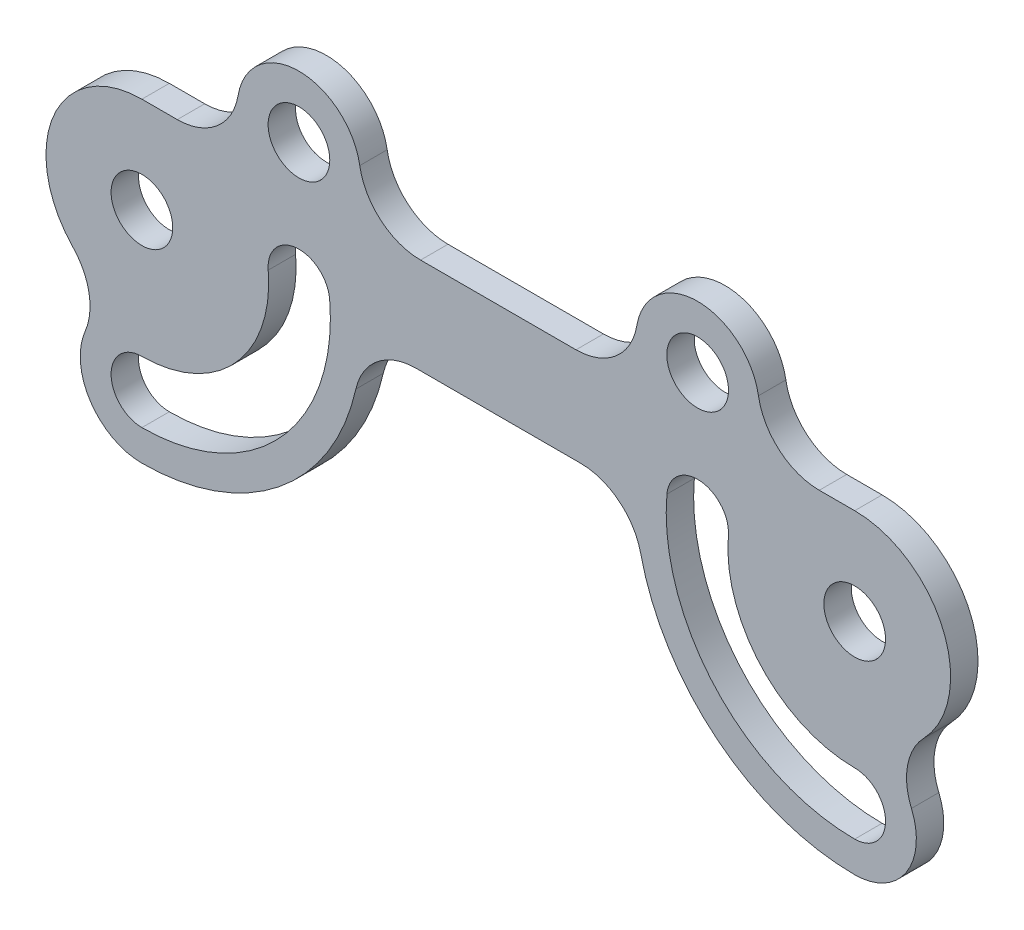
ISO-10303-21;
HEADER;
FILE_DESCRIPTION(('STEP AP214'),'2;1');
FILE_NAME('part.step','',(''),(''),'','','');
FILE_SCHEMA(('AUTOMOTIVE_DESIGN { 1 0 10303 214 1 1 1 1 }'));
ENDSEC;
DATA;
#1=APPLICATION_CONTEXT('core data for automotive mechanical design processes');
#2=APPLICATION_PROTOCOL_DEFINITION('international standard','automotive_design',2000,#1);
#3=PRODUCT_CONTEXT('',#1,'mechanical');
#4=PRODUCT('Part','Part','',(#3));
#5=PRODUCT_RELATED_PRODUCT_CATEGORY('part','',(#4));
#6=PRODUCT_DEFINITION_FORMATION('','',#4);
#7=PRODUCT_DEFINITION_CONTEXT('part definition',#1,'design');
#8=PRODUCT_DEFINITION('design','',#6,#7);
#9=PRODUCT_DEFINITION_SHAPE('','',#8);
#10=(LENGTH_UNIT() NAMED_UNIT(*) SI_UNIT(.MILLI.,.METRE.));
#11=(NAMED_UNIT(*) PLANE_ANGLE_UNIT() SI_UNIT($,.RADIAN.));
#12=(NAMED_UNIT(*) SI_UNIT($,.STERADIAN.) SOLID_ANGLE_UNIT());
#13=UNCERTAINTY_MEASURE_WITH_UNIT(LENGTH_MEASURE(1.E-05),#10,'distance_accuracy_value','');
#14=(GEOMETRIC_REPRESENTATION_CONTEXT(3) GLOBAL_UNCERTAINTY_ASSIGNED_CONTEXT((#13)) GLOBAL_UNIT_ASSIGNED_CONTEXT((#10,
#11,#12)) REPRESENTATION_CONTEXT('',''));
#15=CARTESIAN_POINT('',(0.,0.,0.));
#16=DIRECTION('',(0.,0.,1.));
#17=DIRECTION('',(1.,0.,0.));
#18=AXIS2_PLACEMENT_3D('',#15,#16,#17);
#19=CARTESIAN_POINT('',(0.,-9.128125,1.5875));
#20=DIRECTION('',(0.,0.,-1.));
#21=DIRECTION('',(-1.,0.,0.));
#22=AXIS2_PLACEMENT_3D('',#19,#20,#21);
#23=CYLINDRICAL_SURFACE('',#22,1.7859375);
#24=CARTESIAN_POINT('',(0.,-9.128125,0.));
#25=DIRECTION('',(0.,0.,1.));
#26=DIRECTION('',(1.,0.,0.));
#27=AXIS2_PLACEMENT_3D('',#24,#25,#26);
#28=CIRCLE('',#27,1.7859375);
#29=CARTESIAN_POINT('',(0.,-7.3421875,0.));
#30=VERTEX_POINT('',#29);
#31=CARTESIAN_POINT('',(0.,-10.9140625,0.));
#32=VERTEX_POINT('',#31);
#33=EDGE_CURVE('E388',#30,#32,#28,.T.);
#34=ORIENTED_EDGE('',*,*,#33,.F.);
#35=DIRECTION('',(0.,0.,-1.));
#36=VECTOR('',#35,1.);
#37=CARTESIAN_POINT('',(0.,-7.3421875,1.5875));
#38=LINE('',#37,#36);
#39=CARTESIAN_POINT('',(0.,-7.3421875,1.5875));
#40=VERTEX_POINT('',#39);
#41=EDGE_CURVE('E425',#40,#30,#38,.T.);
#42=ORIENTED_EDGE('',*,*,#41,.F.);
#43=CARTESIAN_POINT('',(0.,-9.128125,1.5875));
#44=DIRECTION('',(0.,0.,1.));
#45=DIRECTION('',(1.,0.,0.));
#46=AXIS2_PLACEMENT_3D('',#43,#44,#45);
#47=CIRCLE('',#46,1.7859375);
#48=CARTESIAN_POINT('',(0.,-10.9140625,1.5875));
#49=VERTEX_POINT('',#48);
#50=EDGE_CURVE('E303',#40,#49,#47,.T.);
#51=ORIENTED_EDGE('',*,*,#50,.T.);
#52=DIRECTION('',(0.,0.,-1.));
#53=VECTOR('',#52,1.);
#54=CARTESIAN_POINT('',(0.,-10.9140625,1.5875));
#55=LINE('',#54,#53);
#56=EDGE_CURVE('E415',#49,#32,#55,.T.);
#57=ORIENTED_EDGE('',*,*,#56,.T.);
#58=EDGE_LOOP('',(#34,#42,#51,#57));
#59=FACE_BOUND('',#58,.T.);
#60=ADVANCED_FACE('F39',(#59),#23,.F.);
#61=CARTESIAN_POINT('',(0.,0.,1.5875));
#62=DIRECTION('',(0.,0.,-1.));
#63=DIRECTION('',(-1.,0.,0.));
#64=AXIS2_PLACEMENT_3D('',#61,#62,#63);
#65=CYLINDRICAL_SURFACE('',#64,7.3421875);
#66=CARTESIAN_POINT('',(0.,0.,0.));
#67=DIRECTION('',(0.,0.,1.));
#68=DIRECTION('',(1.,0.,0.));
#69=AXIS2_PLACEMENT_3D('',#66,#67,#68);
#70=CIRCLE('',#69,7.3421875);
#71=CARTESIAN_POINT('',(7.31424825989549,0.639913804955099,0.));
#72=VERTEX_POINT('',#71);
#73=EDGE_CURVE('E392',#30,#72,#70,.T.);
#74=ORIENTED_EDGE('',*,*,#73,.T.);
#75=DIRECTION('',(0.,0.,-1.));
#76=VECTOR('',#75,1.);
#77=CARTESIAN_POINT('',(7.31424825989549,0.639913804955099,1.5875));
#78=LINE('',#77,#76);
#79=CARTESIAN_POINT('',(7.31424825989549,0.639913804955099,1.5875));
#80=VERTEX_POINT('',#79);
#81=EDGE_CURVE('E422',#80,#72,#78,.T.);
#82=ORIENTED_EDGE('',*,*,#81,.F.);
#83=CARTESIAN_POINT('',(0.,0.,1.5875));
#84=DIRECTION('',(0.,0.,1.));
#85=DIRECTION('',(1.,0.,0.));
#86=AXIS2_PLACEMENT_3D('',#83,#84,#85);
#87=CIRCLE('',#86,7.3421875);
#88=EDGE_CURVE('E307',#40,#80,#87,.T.);
#89=ORIENTED_EDGE('',*,*,#88,.F.);
#90=ORIENTED_EDGE('',*,*,#41,.T.);
#91=EDGE_LOOP('',(#74,#82,#89,#90));
#92=FACE_BOUND('',#91,.T.);
#93=ADVANCED_FACE('F605',(#92),#65,.T.);
#94=CARTESIAN_POINT('',(9.09338972851871,0.795568514268501,1.5875));
#95=DIRECTION('',(0.,0.,-1.));
#96=DIRECTION('',(-1.,0.,0.));
#97=AXIS2_PLACEMENT_3D('',#94,#95,#96);
#98=CYLINDRICAL_SURFACE('',#97,1.7859375);
#99=CARTESIAN_POINT('',(9.09338972851871,0.795568514268501,0.));
#100=DIRECTION('',(0.,0.,1.));
#101=DIRECTION('',(1.,0.,0.));
#102=AXIS2_PLACEMENT_3D('',#99,#100,#101);
#103=CIRCLE('',#102,1.7859375);
#104=CARTESIAN_POINT('',(10.8725311971419,0.951223223581904,0.));
#105=VERTEX_POINT('',#104);
#106=EDGE_CURVE('E396',#105,#72,#103,.T.);
#107=ORIENTED_EDGE('',*,*,#106,.F.);
#108=DIRECTION('',(0.,0.,-1.));
#109=VECTOR('',#108,1.);
#110=CARTESIAN_POINT('',(10.8725311971419,0.951223223581904,1.5875));
#111=LINE('',#110,#109);
#112=CARTESIAN_POINT('',(10.8725311971419,0.951223223581904,1.5875));
#113=VERTEX_POINT('',#112);
#114=EDGE_CURVE('E418',#113,#105,#111,.T.);
#115=ORIENTED_EDGE('',*,*,#114,.F.);
#116=CARTESIAN_POINT('',(9.09338972851871,0.795568514268501,1.5875));
#117=DIRECTION('',(0.,0.,1.));
#118=DIRECTION('',(1.,0.,0.));
#119=AXIS2_PLACEMENT_3D('',#116,#117,#118);
#120=CIRCLE('',#119,1.7859375);
#121=EDGE_CURVE('E310',#113,#80,#120,.T.);
#122=ORIENTED_EDGE('',*,*,#121,.T.);
#123=ORIENTED_EDGE('',*,*,#81,.T.);
#124=EDGE_LOOP('',(#107,#115,#122,#123));
#125=FACE_BOUND('',#124,.T.);
#126=ADVANCED_FACE('F611',(#125),#98,.F.);
#127=CARTESIAN_POINT('',(0.,0.,1.5875));
#128=DIRECTION('',(0.,0.,-1.));
#129=DIRECTION('',(-1.,0.,0.));
#130=AXIS2_PLACEMENT_3D('',#127,#128,#129);
#131=CYLINDRICAL_SURFACE('',#130,5.55625);
#132=CARTESIAN_POINT('',(0.,0.,0.));
#133=DIRECTION('',(0.,0.,1.));
#134=DIRECTION('',(1.,0.,0.));
#135=AXIS2_PLACEMENT_3D('',#132,#133,#134);
#136=CIRCLE('',#135,5.55625);
#137=CARTESIAN_POINT('',(0.,5.55625,0.));
#138=VERTEX_POINT('',#137);
#139=CARTESIAN_POINT('',(-4.0016363402321,-3.8547140831758,0.));
#140=VERTEX_POINT('',#139);
#141=EDGE_CURVE('E344',#138,#140,#136,.T.);
#142=ORIENTED_EDGE('',*,*,#141,.T.);
#143=DIRECTION('',(0.,0.,-1.));
#144=VECTOR('',#143,1.);
#145=CARTESIAN_POINT('',(-4.0016363402321,-3.8547140831758,1.5875));
#146=LINE('',#145,#144);
#147=CARTESIAN_POINT('',(-4.0016363402321,-3.8547140831758,1.5875));
#148=VERTEX_POINT('',#147);
#149=EDGE_CURVE('E459',#140,#148,#146,.F.);
#150=ORIENTED_EDGE('',*,*,#149,.T.);
#151=CARTESIAN_POINT('',(0.,0.,1.5875));
#152=DIRECTION('',(0.,0.,1.));
#153=DIRECTION('',(1.,0.,0.));
#154=AXIS2_PLACEMENT_3D('',#151,#152,#153);
#155=CIRCLE('',#154,5.55625);
#156=CARTESIAN_POINT('',(0.,5.55625,1.5875));
#157=VERTEX_POINT('',#156);
#158=EDGE_CURVE('E260',#157,#148,#155,.T.);
#159=ORIENTED_EDGE('',*,*,#158,.F.);
#160=DIRECTION('',(0.,0.,-1.));
#161=VECTOR('',#160,1.);
#162=CARTESIAN_POINT('',(0.,5.55625,1.5875));
#163=LINE('',#162,#161);
#164=EDGE_CURVE('E248',#157,#138,#163,.T.);
#165=ORIENTED_EDGE('',*,*,#164,.T.);
#166=EDGE_LOOP('',(#142,#150,#159,#165));
#167=FACE_BOUND('',#166,.T.);
#168=ADVANCED_FACE('F650',(#167),#131,.T.);
#169=CARTESIAN_POINT('',(0.,-9.128125,1.5875));
#170=DIRECTION('',(0.,0.,-1.));
#171=DIRECTION('',(-1.,0.,0.));
#172=AXIS2_PLACEMENT_3D('',#169,#170,#171);
#173=CYLINDRICAL_SURFACE('',#172,3.571875);
#174=CARTESIAN_POINT('',(0.,-9.128125,1.5875));
#175=DIRECTION('',(0.,0.,1.));
#176=DIRECTION('',(1.,0.,0.));
#177=AXIS2_PLACEMENT_3D('',#174,#175,#176);
#178=CIRCLE('',#177,3.571875);
#179=CARTESIAN_POINT('',(-3.28705842233351,-7.73043478260869,1.5875));
#180=VERTEX_POINT('',#179);
#181=CARTESIAN_POINT('',(0.,-12.7,1.5875));
#182=VERTEX_POINT('',#181);
#183=EDGE_CURVE('E264',#180,#182,#178,.T.);
#184=ORIENTED_EDGE('',*,*,#183,.F.);
#185=DIRECTION('',(0.,0.,-1.));
#186=VECTOR('',#185,1.);
#187=CARTESIAN_POINT('',(-3.28705842233351,-7.73043478260869,1.5875));
#188=LINE('',#187,#186);
#189=CARTESIAN_POINT('',(-3.28705842233351,-7.73043478260869,0.));
#190=VERTEX_POINT('',#189);
#191=EDGE_CURVE('E455',#180,#190,#188,.T.);
#192=ORIENTED_EDGE('',*,*,#191,.T.);
#193=CARTESIAN_POINT('',(0.,-9.128125,0.));
#194=DIRECTION('',(0.,0.,1.));
#195=DIRECTION('',(1.,0.,0.));
#196=AXIS2_PLACEMENT_3D('',#193,#194,#195);
#197=CIRCLE('',#196,3.571875);
#198=CARTESIAN_POINT('',(0.,-12.7,0.));
#199=VERTEX_POINT('',#198);
#200=EDGE_CURVE('E348',#190,#199,#197,.T.);
#201=ORIENTED_EDGE('',*,*,#200,.T.);
#202=DIRECTION('',(0.,0.,-1.));
#203=VECTOR('',#202,1.);
#204=CARTESIAN_POINT('',(0.,-12.7,1.5875));
#205=LINE('',#204,#203);
#206=EDGE_CURVE('E419',#182,#199,#205,.T.);
#207=ORIENTED_EDGE('',*,*,#206,.F.);
#208=EDGE_LOOP('',(#184,#192,#201,#207));
#209=FACE_BOUND('',#208,.T.);
#210=ADVANCED_FACE('F646',(#209),#173,.T.);
#211=CARTESIAN_POINT('',(0.,0.,1.5875));
#212=DIRECTION('',(0.,0.,-1.));
#213=DIRECTION('',(-1.,0.,0.));
#214=AXIS2_PLACEMENT_3D('',#211,#212,#213);
#215=CYLINDRICAL_SURFACE('',#214,12.7);
#216=CARTESIAN_POINT('',(0.,0.,0.));
#217=DIRECTION('',(0.,0.,1.));
#218=DIRECTION('',(1.,0.,0.));
#219=AXIS2_PLACEMENT_3D('',#216,#217,#218);
#220=CIRCLE('',#219,12.7);
#221=CARTESIAN_POINT('',(12.390243902439,-2.78780487804878,0.));
#222=VERTEX_POINT('',#221);
#223=EDGE_CURVE('E351',#199,#222,#220,.T.);
#224=ORIENTED_EDGE('',*,*,#223,.T.);
#225=DIRECTION('',(0.,0.,-1.));
#226=VECTOR('',#225,1.);
#227=CARTESIAN_POINT('',(12.390243902439,-2.78780487804878,1.5875));
#228=LINE('',#227,#226);
#229=CARTESIAN_POINT('',(12.390243902439,-2.78780487804878,1.5875));
#230=VERTEX_POINT('',#229);
#231=EDGE_CURVE('E469',#222,#230,#228,.F.);
#232=ORIENTED_EDGE('',*,*,#231,.T.);
#233=CARTESIAN_POINT('',(0.,0.,1.5875));
#234=DIRECTION('',(0.,0.,1.));
#235=DIRECTION('',(1.,0.,0.));
#236=AXIS2_PLACEMENT_3D('',#233,#234,#235);
#237=CIRCLE('',#236,12.7);
#238=EDGE_CURVE('E267',#182,#230,#237,.T.);
#239=ORIENTED_EDGE('',*,*,#238,.F.);
#240=ORIENTED_EDGE('',*,*,#206,.T.);
#241=EDGE_LOOP('',(#224,#232,#239,#240));
#242=FACE_BOUND('',#241,.T.);
#243=ADVANCED_FACE('F642',(#242),#215,.T.);
#244=CARTESIAN_POINT('',(0.,0.,1.5875));
#245=DIRECTION('',(0.,1.,0.));
#246=DIRECTION('',(0.,0.,1.));
#247=AXIS2_PLACEMENT_3D('',#244,#245,#246);
#248=PLANE('',#247);
#249=DIRECTION('',(1.,0.,0.));
#250=VECTOR('',#249,1.);
#251=CARTESIAN_POINT('',(0.,0.,1.5875));
#252=LINE('',#251,#250);
#253=CARTESIAN_POINT('',(15.875,0.,1.5875));
#254=VERTEX_POINT('',#253);
#255=CARTESIAN_POINT('',(25.4,0.,1.5875));
#256=VERTEX_POINT('',#255);
#257=EDGE_CURVE('E271',#254,#256,#252,.T.);
#258=ORIENTED_EDGE('',*,*,#257,.F.);
#259=DIRECTION('',(0.,0.,1.));
#260=VECTOR('',#259,1.);
#261=CARTESIAN_POINT('',(15.875,0.,0.));
#262=LINE('',#261,#260);
#263=CARTESIAN_POINT('',(15.875,0.,0.));
#264=VERTEX_POINT('',#263);
#265=EDGE_CURVE('E465',#254,#264,#262,.F.);
#266=ORIENTED_EDGE('',*,*,#265,.T.);
#267=DIRECTION('',(1.,0.,0.));
#268=VECTOR('',#267,1.);
#269=CARTESIAN_POINT('',(0.,0.,0.));
#270=LINE('',#269,#268);
#271=CARTESIAN_POINT('',(25.4,0.,0.));
#272=VERTEX_POINT('',#271);
#273=EDGE_CURVE('E355',#264,#272,#270,.T.);
#274=ORIENTED_EDGE('',*,*,#273,.T.);
#275=DIRECTION('',(0.,0.,1.));
#276=VECTOR('',#275,1.);
#277=CARTESIAN_POINT('',(25.4,0.,1.5875));
#278=LINE('',#277,#276);
#279=EDGE_CURVE('E462',#272,#256,#278,.T.);
#280=ORIENTED_EDGE('',*,*,#279,.T.);
#281=EDGE_LOOP('',(#258,#266,#274,#280));
#282=FACE_BOUND('',#281,.T.);
#283=ADVANCED_FACE('F638',(#282),#248,.F.);
#284=CARTESIAN_POINT('',(41.275,0.,1.5875));
#285=DIRECTION('',(0.,0.,-1.));
#286=DIRECTION('',(-1.,0.,0.));
#287=AXIS2_PLACEMENT_3D('',#284,#285,#286);
#288=CYLINDRICAL_SURFACE('',#287,12.7);
#289=CARTESIAN_POINT('',(41.275,0.,1.5875));
#290=DIRECTION('',(0.,0.,1.));
#291=DIRECTION('',(1.,0.,0.));
#292=AXIS2_PLACEMENT_3D('',#289,#290,#291);
#293=CIRCLE('',#292,12.7);
#294=CARTESIAN_POINT('',(28.884756097561,-2.78780487804878,1.5875));
#295=VERTEX_POINT('',#294);
#296=CARTESIAN_POINT('',(41.275,-12.7,1.5875));
#297=VERTEX_POINT('',#296);
#298=EDGE_CURVE('E275',#295,#297,#293,.T.);
#299=ORIENTED_EDGE('',*,*,#298,.F.);
#300=DIRECTION('',(0.,0.,-1.));
#301=VECTOR('',#300,1.);
#302=CARTESIAN_POINT('',(28.884756097561,-2.78780487804878,1.5875));
#303=LINE('',#302,#301);
#304=CARTESIAN_POINT('',(28.884756097561,-2.78780487804878,0.));
#305=VERTEX_POINT('',#304);
#306=EDGE_CURVE('E472',#295,#305,#303,.T.);
#307=ORIENTED_EDGE('',*,*,#306,.T.);
#308=CARTESIAN_POINT('',(41.275,0.,0.));
#309=DIRECTION('',(0.,0.,1.));
#310=DIRECTION('',(1.,0.,0.));
#311=AXIS2_PLACEMENT_3D('',#308,#309,#310);
#312=CIRCLE('',#311,12.7);
#313=CARTESIAN_POINT('',(41.275,-12.7,0.));
#314=VERTEX_POINT('',#313);
#315=EDGE_CURVE('E359',#305,#314,#312,.T.);
#316=ORIENTED_EDGE('',*,*,#315,.T.);
#317=DIRECTION('',(0.,0.,-1.));
#318=VECTOR('',#317,1.);
#319=CARTESIAN_POINT('',(41.275,-12.7,1.5875));
#320=LINE('',#319,#318);
#321=EDGE_CURVE('E435',#297,#314,#320,.T.);
#322=ORIENTED_EDGE('',*,*,#321,.F.);
#323=EDGE_LOOP('',(#299,#307,#316,#322));
#324=FACE_BOUND('',#323,.T.);
#325=ADVANCED_FACE('F634',(#324),#288,.T.);
#326=CARTESIAN_POINT('',(41.275,-9.128125,1.5875));
#327=DIRECTION('',(0.,0.,-1.));
#328=DIRECTION('',(-1.,0.,0.));
#329=AXIS2_PLACEMENT_3D('',#326,#327,#328);
#330=CYLINDRICAL_SURFACE('',#329,3.571875);
#331=CARTESIAN_POINT('',(41.275,-9.128125,0.));
#332=DIRECTION('',(0.,0.,1.));
#333=DIRECTION('',(1.,0.,0.));
#334=AXIS2_PLACEMENT_3D('',#331,#332,#333);
#335=CIRCLE('',#334,3.571875);
#336=CARTESIAN_POINT('',(44.5620584223335,-7.7304347826087,0.));
#337=VERTEX_POINT('',#336);
#338=EDGE_CURVE('E362',#314,#337,#335,.T.);
#339=ORIENTED_EDGE('',*,*,#338,.T.);
#340=DIRECTION('',(0.,0.,-1.));
#341=VECTOR('',#340,1.);
#342=CARTESIAN_POINT('',(44.5620584223335,-7.7304347826087,1.5875));
#343=LINE('',#342,#341);
#344=CARTESIAN_POINT('',(44.5620584223335,-7.7304347826087,1.5875));
#345=VERTEX_POINT('',#344);
#346=EDGE_CURVE('E452',#337,#345,#343,.F.);
#347=ORIENTED_EDGE('',*,*,#346,.T.);
#348=CARTESIAN_POINT('',(41.275,-9.128125,1.5875));
#349=DIRECTION('',(0.,0.,1.));
#350=DIRECTION('',(1.,0.,0.));
#351=AXIS2_PLACEMENT_3D('',#348,#349,#350);
#352=CIRCLE('',#351,3.571875);
#353=EDGE_CURVE('E278',#297,#345,#352,.T.);
#354=ORIENTED_EDGE('',*,*,#353,.F.);
#355=ORIENTED_EDGE('',*,*,#321,.T.);
#356=EDGE_LOOP('',(#339,#347,#354,#355));
#357=FACE_BOUND('',#356,.T.);
#358=ADVANCED_FACE('F631',(#357),#330,.T.);
#359=CARTESIAN_POINT('',(41.275,0.,1.5875));
#360=DIRECTION('',(0.,0.,-1.));
#361=DIRECTION('',(-1.,0.,0.));
#362=AXIS2_PLACEMENT_3D('',#359,#360,#361);
#363=CYLINDRICAL_SURFACE('',#362,5.55625);
#364=CARTESIAN_POINT('',(41.275,0.,1.5875));
#365=DIRECTION('',(0.,0.,1.));
#366=DIRECTION('',(1.,0.,0.));
#367=AXIS2_PLACEMENT_3D('',#364,#365,#366);
#368=CIRCLE('',#367,5.55625);
#369=CARTESIAN_POINT('',(45.2766363402321,-3.8547140831758,1.5875));
#370=VERTEX_POINT('',#369);
#371=CARTESIAN_POINT('',(41.275,5.55625,1.5875));
#372=VERTEX_POINT('',#371);
#373=EDGE_CURVE('E282',#370,#372,#368,.T.);
#374=ORIENTED_EDGE('',*,*,#373,.F.);
#375=DIRECTION('',(0.,0.,-1.));
#376=VECTOR('',#375,1.);
#377=CARTESIAN_POINT('',(45.2766363402321,-3.8547140831758,1.5875));
#378=LINE('',#377,#376);
#379=CARTESIAN_POINT('',(45.2766363402321,-3.8547140831758,0.));
#380=VERTEX_POINT('',#379);
#381=EDGE_CURVE('E428',#370,#380,#378,.T.);
#382=ORIENTED_EDGE('',*,*,#381,.T.);
#383=CARTESIAN_POINT('',(41.275,0.,0.));
#384=DIRECTION('',(0.,0.,1.));
#385=DIRECTION('',(1.,0.,0.));
#386=AXIS2_PLACEMENT_3D('',#383,#384,#385);
#387=CIRCLE('',#386,5.55625);
#388=CARTESIAN_POINT('',(41.275,5.55625,0.));
#389=VERTEX_POINT('',#388);
#390=EDGE_CURVE('E366',#380,#389,#387,.T.);
#391=ORIENTED_EDGE('',*,*,#390,.T.);
#392=DIRECTION('',(0.,0.,-1.));
#393=VECTOR('',#392,1.);
#394=CARTESIAN_POINT('',(41.275,5.55625,1.5875));
#395=LINE('',#394,#393);
#396=EDGE_CURVE('E431',#372,#389,#395,.T.);
#397=ORIENTED_EDGE('',*,*,#396,.F.);
#398=EDGE_LOOP('',(#374,#382,#391,#397));
#399=FACE_BOUND('',#398,.T.);
#400=ADVANCED_FACE('F573',(#399),#363,.T.);
#401=CARTESIAN_POINT('',(0.,5.55625,1.5875));
#402=DIRECTION('',(0.,1.,0.));
#403=DIRECTION('',(0.,0.,1.));
#404=AXIS2_PLACEMENT_3D('',#401,#402,#403);
#405=PLANE('',#404);
#406=DIRECTION('',(1.,0.,0.));
#407=VECTOR('',#406,1.);
#408=CARTESIAN_POINT('',(0.,5.55625,0.));
#409=LINE('',#408,#407);
#410=CARTESIAN_POINT('',(39.2257499068081,5.55625,0.));
#411=VERTEX_POINT('',#410);
#412=EDGE_CURVE('E370',#411,#389,#409,.T.);
#413=ORIENTED_EDGE('',*,*,#412,.F.);
#414=DIRECTION('',(0.,0.,-1.));
#415=VECTOR('',#414,1.);
#416=CARTESIAN_POINT('',(39.2257499068081,5.55625,1.5875));
#417=LINE('',#416,#415);
#418=CARTESIAN_POINT('',(39.2257499068081,5.55625,1.5875));
#419=VERTEX_POINT('',#418);
#420=EDGE_CURVE('E483',#411,#419,#417,.F.);
#421=ORIENTED_EDGE('',*,*,#420,.T.);
#422=DIRECTION('',(1.,0.,0.));
#423=VECTOR('',#422,1.);
#424=CARTESIAN_POINT('',(0.,5.55625,1.5875));
#425=LINE('',#424,#423);
#426=EDGE_CURVE('E286',#419,#372,#425,.T.);
#427=ORIENTED_EDGE('',*,*,#426,.T.);
#428=ORIENTED_EDGE('',*,*,#396,.T.);
#429=EDGE_LOOP('',(#413,#421,#427,#428));
#430=FACE_BOUND('',#429,.T.);
#431=ADVANCED_FACE('F564',(#430),#405,.T.);
#432=CARTESIAN_POINT('',(32.1816102714813,7.93931851426843,1.5875));
#433=DIRECTION('',(0.,0.,-1.));
#434=DIRECTION('',(-1.,0.,0.));
#435=AXIS2_PLACEMENT_3D('',#432,#433,#434);
#436=CYLINDRICAL_SURFACE('',#435,3.571875);
#437=CARTESIAN_POINT('',(32.1816102714813,7.93931851426843,1.5875));
#438=DIRECTION('',(0.,0.,1.));
#439=DIRECTION('',(1.,0.,0.));
#440=AXIS2_PLACEMENT_3D('',#437,#438,#439);
#441=CIRCLE('',#440,3.571875);
#442=CARTESIAN_POINT('',(35.7036800891447,8.53372175713422,1.5875));
#443=VERTEX_POINT('',#442);
#444=CARTESIAN_POINT('',(28.6595404538179,8.53372175713422,1.5875));
#445=VERTEX_POINT('',#444);
#446=EDGE_CURVE('E292',#443,#445,#441,.T.);
#447=ORIENTED_EDGE('',*,*,#446,.F.);
#448=DIRECTION('',(0.,0.,-1.));
#449=VECTOR('',#448,1.);
#450=CARTESIAN_POINT('',(35.7036800891447,8.53372175713422,1.5875));
#451=LINE('',#450,#449);
#452=CARTESIAN_POINT('',(35.7036800891447,8.53372175713422,0.));
#453=VERTEX_POINT('',#452);
#454=EDGE_CURVE('E479',#443,#453,#451,.T.);
#455=ORIENTED_EDGE('',*,*,#454,.T.);
#456=CARTESIAN_POINT('',(32.1816102714813,7.93931851426843,0.));
#457=DIRECTION('',(0.,0.,1.));
#458=DIRECTION('',(1.,0.,0.));
#459=AXIS2_PLACEMENT_3D('',#456,#457,#458);
#460=CIRCLE('',#459,3.571875);
#461=CARTESIAN_POINT('',(28.6595404538179,8.53372175713422,0.));
#462=VERTEX_POINT('',#461);
#463=EDGE_CURVE('E376',#453,#462,#460,.T.);
#464=ORIENTED_EDGE('',*,*,#463,.T.);
#465=DIRECTION('',(0.,0.,-1.));
#466=VECTOR('',#465,1.);
#467=CARTESIAN_POINT('',(28.6595404538179,8.53372175713422,1.5875));
#468=LINE('',#467,#466);
#469=EDGE_CURVE('E476',#462,#445,#468,.F.);
#470=ORIENTED_EDGE('',*,*,#469,.T.);
#471=EDGE_LOOP('',(#447,#455,#464,#470));
#472=FACE_BOUND('',#471,.T.);
#473=ADVANCED_FACE('F585',(#472),#436,.T.);
#474=CARTESIAN_POINT('',(16.1375293638456,5.55625,1.5875));
#475=VERTEX_POINT('',#474);
#476=CARTESIAN_POINT('',(25.1374706361544,5.55625,1.5875));
#477=VERTEX_POINT('',#476);
#478=EDGE_CURVE('E287',#475,#477,#425,.T.);
#479=ORIENTED_EDGE('',*,*,#478,.T.);
#480=DIRECTION('',(0.,0.,-1.));
#481=VECTOR('',#480,1.);
#482=CARTESIAN_POINT('',(25.1374706361544,5.55625,1.5875));
#483=LINE('',#482,#481);
#484=CARTESIAN_POINT('',(25.1374706361544,5.55625,0.));
#485=VERTEX_POINT('',#484);
#486=EDGE_CURVE('E489',#477,#485,#483,.T.);
#487=ORIENTED_EDGE('',*,*,#486,.T.);
#488=CARTESIAN_POINT('',(16.1375293638456,5.55625,0.));
#489=VERTEX_POINT('',#488);
#490=EDGE_CURVE('E371',#489,#485,#409,.T.);
#491=ORIENTED_EDGE('',*,*,#490,.F.);
#492=DIRECTION('',(0.,0.,-1.));
#493=VECTOR('',#492,1.);
#494=CARTESIAN_POINT('',(16.1375293638456,5.55625,1.5875));
#495=LINE('',#494,#493);
#496=EDGE_CURVE('E486',#489,#475,#495,.F.);
#497=ORIENTED_EDGE('',*,*,#496,.T.);
#498=EDGE_LOOP('',(#479,#487,#491,#497));
#499=FACE_BOUND('',#498,.T.);
#500=ADVANCED_FACE('F593',(#499),#405,.T.);
#501=CARTESIAN_POINT('',(9.09338972851871,7.9393185142685,1.5875));
#502=DIRECTION('',(0.,0.,-1.));
#503=DIRECTION('',(-1.,0.,0.));
#504=AXIS2_PLACEMENT_3D('',#501,#502,#503);
#505=CYLINDRICAL_SURFACE('',#504,3.571875);
#506=CARTESIAN_POINT('',(9.09338972851871,7.9393185142685,1.5875));
#507=DIRECTION('',(0.,0.,1.));
#508=DIRECTION('',(1.,0.,0.));
#509=AXIS2_PLACEMENT_3D('',#506,#507,#508);
#510=CIRCLE('',#509,3.571875);
#511=CARTESIAN_POINT('',(12.6154595461821,8.53372175713425,1.5875));
#512=VERTEX_POINT('',#511);
#513=CARTESIAN_POINT('',(5.57131991085528,8.53372175713425,1.5875));
#514=VERTEX_POINT('',#513);
#515=EDGE_CURVE('E291',#512,#514,#510,.T.);
#516=ORIENTED_EDGE('',*,*,#515,.F.);
#517=DIRECTION('',(0.,0.,-1.));
#518=VECTOR('',#517,1.);
#519=CARTESIAN_POINT('',(12.6154595461821,8.53372175713425,1.5875));
#520=LINE('',#519,#518);
#521=CARTESIAN_POINT('',(12.6154595461821,8.53372175713425,0.));
#522=VERTEX_POINT('',#521);
#523=EDGE_CURVE('E496',#512,#522,#520,.T.);
#524=ORIENTED_EDGE('',*,*,#523,.T.);
#525=CARTESIAN_POINT('',(9.09338972851871,7.9393185142685,0.));
#526=DIRECTION('',(0.,0.,1.));
#527=DIRECTION('',(1.,0.,0.));
#528=AXIS2_PLACEMENT_3D('',#525,#526,#527);
#529=CIRCLE('',#528,3.571875);
#530=CARTESIAN_POINT('',(5.57131991085528,8.53372175713425,0.));
#531=VERTEX_POINT('',#530);
#532=EDGE_CURVE('E375',#522,#531,#529,.T.);
#533=ORIENTED_EDGE('',*,*,#532,.T.);
#534=DIRECTION('',(0.,0.,-1.));
#535=VECTOR('',#534,1.);
#536=CARTESIAN_POINT('',(5.57131991085528,8.53372175713425,1.5875));
#537=LINE('',#536,#535);
#538=EDGE_CURVE('E493',#531,#514,#537,.F.);
#539=ORIENTED_EDGE('',*,*,#538,.T.);
#540=EDGE_LOOP('',(#516,#524,#533,#539));
#541=FACE_BOUND('',#540,.T.);
#542=ADVANCED_FACE('F554',(#541),#505,.T.);
#543=CARTESIAN_POINT('',(41.275,0.,1.5875));
#544=DIRECTION('',(0.,0.,-1.));
#545=DIRECTION('',(-1.,0.,0.));
#546=AXIS2_PLACEMENT_3D('',#543,#544,#545);
#547=CYLINDRICAL_SURFACE('',#546,7.3421875);
#548=CARTESIAN_POINT('',(41.275,0.,0.));
#549=DIRECTION('',(0.,0.,1.));
#550=DIRECTION('',(1.,0.,0.));
#551=AXIS2_PLACEMENT_3D('',#548,#549,#550);
#552=CIRCLE('',#551,7.3421875);
#553=CARTESIAN_POINT('',(33.9607517401045,0.639913804955042,0.));
#554=VERTEX_POINT('',#553);
#555=CARTESIAN_POINT('',(41.275,-7.3421875,0.));
#556=VERTEX_POINT('',#555);
#557=EDGE_CURVE('E243',#554,#556,#552,.T.);
#558=ORIENTED_EDGE('',*,*,#557,.T.);
#559=DIRECTION('',(0.,0.,-1.));
#560=VECTOR('',#559,1.);
#561=CARTESIAN_POINT('',(41.275,-7.3421875,1.5875));
#562=LINE('',#561,#560);
#563=CARTESIAN_POINT('',(41.275,-7.3421875,1.5875));
#564=VERTEX_POINT('',#563);
#565=EDGE_CURVE('E240',#564,#556,#562,.T.);
#566=ORIENTED_EDGE('',*,*,#565,.F.);
#567=CARTESIAN_POINT('',(41.275,0.,1.5875));
#568=DIRECTION('',(0.,0.,1.));
#569=DIRECTION('',(1.,0.,0.));
#570=AXIS2_PLACEMENT_3D('',#567,#568,#569);
#571=CIRCLE('',#570,7.3421875);
#572=CARTESIAN_POINT('',(33.9607517401045,0.639913804955042,1.5875));
#573=VERTEX_POINT('',#572);
#574=EDGE_CURVE('E226',#573,#564,#571,.T.);
#575=ORIENTED_EDGE('',*,*,#574,.F.);
#576=DIRECTION('',(0.,0.,-1.));
#577=VECTOR('',#576,1.);
#578=CARTESIAN_POINT('',(33.9607517401045,0.639913804955042,1.5875));
#579=LINE('',#578,#577);
#580=EDGE_CURVE('E330',#573,#554,#579,.T.);
#581=ORIENTED_EDGE('',*,*,#580,.T.);
#582=EDGE_LOOP('',(#558,#566,#575,#581));
#583=FACE_BOUND('',#582,.T.);
#584=ADVANCED_FACE('F241',(#583),#547,.T.);
#585=CARTESIAN_POINT('',(41.275,-9.128125,1.5875));
#586=DIRECTION('',(0.,0.,-1.));
#587=DIRECTION('',(-1.,0.,0.));
#588=AXIS2_PLACEMENT_3D('',#585,#586,#587);
#589=CYLINDRICAL_SURFACE('',#588,1.7859375);
#590=CARTESIAN_POINT('',(41.275,-9.128125,0.));
#591=DIRECTION('',(0.,0.,1.));
#592=DIRECTION('',(1.,0.,0.));
#593=AXIS2_PLACEMENT_3D('',#590,#591,#592);
#594=CIRCLE('',#593,1.7859375);
#595=CARTESIAN_POINT('',(41.275,-10.9140625,0.));
#596=VERTEX_POINT('',#595);
#597=EDGE_CURVE('E333',#596,#556,#594,.T.);
#598=ORIENTED_EDGE('',*,*,#597,.F.);
#599=DIRECTION('',(0.,0.,-1.));
#600=VECTOR('',#599,1.);
#601=CARTESIAN_POINT('',(41.275,-10.9140625,1.5875));
#602=LINE('',#601,#600);
#603=CARTESIAN_POINT('',(41.275,-10.9140625,1.5875));
#604=VERTEX_POINT('',#603);
#605=EDGE_CURVE('E249',#604,#596,#602,.T.);
#606=ORIENTED_EDGE('',*,*,#605,.F.);
#607=CARTESIAN_POINT('',(41.275,-9.128125,1.5875));
#608=DIRECTION('',(0.,0.,1.));
#609=DIRECTION('',(1.,0.,0.));
#610=AXIS2_PLACEMENT_3D('',#607,#608,#609);
#611=CIRCLE('',#610,1.7859375);
#612=EDGE_CURVE('E231',#604,#564,#611,.T.);
#613=ORIENTED_EDGE('',*,*,#612,.T.);
#614=ORIENTED_EDGE('',*,*,#565,.T.);
#615=EDGE_LOOP('',(#598,#606,#613,#614));
#616=FACE_BOUND('',#615,.T.);
#617=ADVANCED_FACE('F251',(#616),#589,.F.);
#618=CARTESIAN_POINT('',(41.275,0.,1.5875));
#619=DIRECTION('',(0.,0.,-1.));
#620=DIRECTION('',(-1.,0.,0.));
#621=AXIS2_PLACEMENT_3D('',#618,#619,#620);
#622=CYLINDRICAL_SURFACE('',#621,10.9140625);
#623=CARTESIAN_POINT('',(41.275,0.,0.));
#624=DIRECTION('',(0.,0.,1.));
#625=DIRECTION('',(1.,0.,0.));
#626=AXIS2_PLACEMENT_3D('',#623,#624,#625);
#627=CIRCLE('',#626,10.9140625);
#628=CARTESIAN_POINT('',(30.402468802858,0.951223223581821,0.));
#629=VERTEX_POINT('',#628);
#630=EDGE_CURVE('E336',#629,#596,#627,.T.);
#631=ORIENTED_EDGE('',*,*,#630,.F.);
#632=DIRECTION('',(0.,0.,-1.));
#633=VECTOR('',#632,1.);
#634=CARTESIAN_POINT('',(30.402468802858,0.951223223581821,1.5875));
#635=LINE('',#634,#633);
#636=CARTESIAN_POINT('',(30.402468802858,0.951223223581821,1.5875));
#637=VERTEX_POINT('',#636);
#638=EDGE_CURVE('E444',#637,#629,#635,.T.);
#639=ORIENTED_EDGE('',*,*,#638,.F.);
#640=CARTESIAN_POINT('',(41.275,0.,1.5875));
#641=DIRECTION('',(0.,0.,1.));
#642=DIRECTION('',(1.,0.,0.));
#643=AXIS2_PLACEMENT_3D('',#640,#641,#642);
#644=CIRCLE('',#643,10.9140625);
#645=EDGE_CURVE('E253',#637,#604,#644,.T.);
#646=ORIENTED_EDGE('',*,*,#645,.T.);
#647=ORIENTED_EDGE('',*,*,#605,.T.);
#648=EDGE_LOOP('',(#631,#639,#646,#647));
#649=FACE_BOUND('',#648,.T.);
#650=ADVANCED_FACE('F659',(#649),#622,.F.);
#651=CARTESIAN_POINT('',(41.275,0.,1.5875));
#652=DIRECTION('',(0.,0.,-1.));
#653=DIRECTION('',(-1.,0.,0.));
#654=AXIS2_PLACEMENT_3D('',#651,#652,#653);
#655=CYLINDRICAL_SURFACE('',#654,1.7859375);
#656=CARTESIAN_POINT('',(41.275,0.,1.5875));
#657=DIRECTION('',(0.,0.,1.));
#658=DIRECTION('',(1.,0.,0.));
#659=AXIS2_PLACEMENT_3D('',#656,#657,#658);
#660=CIRCLE('',#659,1.7859375);
#661=CARTESIAN_POINT('',(43.0609375,0.,1.5875));
#662=VERTEX_POINT('',#661);
#663=EDGE_CURVE('E322',#662,#662,#660,.T.);
#664=ORIENTED_EDGE('',*,*,#663,.T.);
#665=EDGE_LOOP('',(#664));
#666=FACE_BOUND('',#665,.T.);
#667=CARTESIAN_POINT('',(41.275,0.,0.));
#668=DIRECTION('',(0.,0.,1.));
#669=DIRECTION('',(1.,0.,0.));
#670=AXIS2_PLACEMENT_3D('',#667,#668,#669);
#671=CIRCLE('',#670,1.7859375);
#672=CARTESIAN_POINT('',(43.0609375,0.,0.));
#673=VERTEX_POINT('',#672);
#674=EDGE_CURVE('E408',#673,#673,#671,.T.);
#675=ORIENTED_EDGE('',*,*,#674,.F.);
#676=EDGE_LOOP('',(#675));
#677=FACE_BOUND('',#676,.T.);
#678=ADVANCED_FACE('F662',(#666,#677),#655,.F.);
#679=CARTESIAN_POINT('',(0.,0.,1.5875));
#680=DIRECTION('',(0.,0.,-1.));
#681=DIRECTION('',(-1.,0.,0.));
#682=AXIS2_PLACEMENT_3D('',#679,#680,#681);
#683=CYLINDRICAL_SURFACE('',#682,1.7859375);
#684=CARTESIAN_POINT('',(0.,0.,1.5875));
#685=DIRECTION('',(0.,0.,1.));
#686=DIRECTION('',(1.,0.,0.));
#687=AXIS2_PLACEMENT_3D('',#684,#685,#686);
#688=CIRCLE('',#687,1.7859375);
#689=CARTESIAN_POINT('',(1.7859375,0.,1.5875));
#690=VERTEX_POINT('',#689);
#691=EDGE_CURVE('E318',#690,#690,#688,.T.);
#692=ORIENTED_EDGE('',*,*,#691,.T.);
#693=EDGE_LOOP('',(#692));
#694=FACE_BOUND('',#693,.T.);
#695=CARTESIAN_POINT('',(0.,0.,0.));
#696=DIRECTION('',(0.,0.,1.));
#697=DIRECTION('',(1.,0.,0.));
#698=AXIS2_PLACEMENT_3D('',#695,#696,#697);
#699=CIRCLE('',#698,1.7859375);
#700=CARTESIAN_POINT('',(1.7859375,0.,0.));
#701=VERTEX_POINT('',#700);
#702=EDGE_CURVE('E404',#701,#701,#699,.T.);
#703=ORIENTED_EDGE('',*,*,#702,.F.);
#704=EDGE_LOOP('',(#703));
#705=FACE_BOUND('',#704,.T.);
#706=ADVANCED_FACE('F856',(#694,#705),#683,.F.);
#707=CARTESIAN_POINT('',(0.,0.,1.5875));
#708=DIRECTION('',(0.,0.,-1.));
#709=DIRECTION('',(-1.,0.,0.));
#710=AXIS2_PLACEMENT_3D('',#707,#708,#709);
#711=CYLINDRICAL_SURFACE('',#710,10.9140625);
#712=CARTESIAN_POINT('',(0.,0.,0.));
#713=DIRECTION('',(0.,0.,1.));
#714=DIRECTION('',(1.,0.,0.));
#715=AXIS2_PLACEMENT_3D('',#712,#713,#714);
#716=CIRCLE('',#715,10.9140625);
#717=EDGE_CURVE('E400',#32,#105,#716,.T.);
#718=ORIENTED_EDGE('',*,*,#717,.F.);
#719=ORIENTED_EDGE('',*,*,#56,.F.);
#720=CARTESIAN_POINT('',(0.,0.,1.5875));
#721=DIRECTION('',(0.,0.,1.));
#722=DIRECTION('',(1.,0.,0.));
#723=AXIS2_PLACEMENT_3D('',#720,#721,#722);
#724=CIRCLE('',#723,10.9140625);
#725=EDGE_CURVE('E314',#49,#113,#724,.T.);
#726=ORIENTED_EDGE('',*,*,#725,.T.);
#727=ORIENTED_EDGE('',*,*,#114,.T.);
#728=EDGE_LOOP('',(#718,#719,#726,#727));
#729=FACE_BOUND('',#728,.T.);
#730=ADVANCED_FACE('F620',(#729),#711,.F.);
#731=CARTESIAN_POINT('',(32.1816102714813,7.93931851426843,1.5875));
#732=DIRECTION('',(0.,0.,-1.));
#733=DIRECTION('',(-1.,0.,0.));
#734=AXIS2_PLACEMENT_3D('',#731,#732,#733);
#735=CYLINDRICAL_SURFACE('',#734,1.7859375);
#736=CARTESIAN_POINT('',(32.1816102714813,7.93931851426843,1.5875));
#737=DIRECTION('',(0.,0.,1.));
#738=DIRECTION('',(1.,0.,0.));
#739=AXIS2_PLACEMENT_3D('',#736,#737,#738);
#740=CIRCLE('',#739,1.7859375);
#741=CARTESIAN_POINT('',(33.9675477714813,7.93931851426843,1.5875));
#742=VERTEX_POINT('',#741);
#743=EDGE_CURVE('E299',#742,#742,#740,.T.);
#744=ORIENTED_EDGE('',*,*,#743,.T.);
#745=EDGE_LOOP('',(#744));
#746=FACE_BOUND('',#745,.T.);
#747=CARTESIAN_POINT('',(32.1816102714813,7.93931851426843,0.));
#748=DIRECTION('',(0.,0.,1.));
#749=DIRECTION('',(1.,0.,0.));
#750=AXIS2_PLACEMENT_3D('',#747,#748,#749);
#751=CIRCLE('',#750,1.7859375);
#752=CARTESIAN_POINT('',(33.9675477714813,7.93931851426843,0.));
#753=VERTEX_POINT('',#752);
#754=EDGE_CURVE('E384',#753,#753,#751,.T.);
#755=ORIENTED_EDGE('',*,*,#754,.F.);
#756=EDGE_LOOP('',(#755));
#757=FACE_BOUND('',#756,.T.);
#758=ADVANCED_FACE('F617',(#746,#757),#735,.F.);
#759=CARTESIAN_POINT('',(2.04925009319186,5.55625,1.5875));
#760=VERTEX_POINT('',#759);
#761=EDGE_CURVE('E293',#157,#760,#425,.T.);
#762=ORIENTED_EDGE('',*,*,#761,.T.);
#763=DIRECTION('',(0.,0.,-1.));
#764=VECTOR('',#763,1.);
#765=CARTESIAN_POINT('',(2.04925009319186,5.55625,1.5875));
#766=LINE('',#765,#764);
#767=CARTESIAN_POINT('',(2.04925009319186,5.55625,0.));
#768=VERTEX_POINT('',#767);
#769=EDGE_CURVE('E500',#760,#768,#766,.T.);
#770=ORIENTED_EDGE('',*,*,#769,.T.);
#771=EDGE_CURVE('E377',#138,#768,#409,.T.);
#772=ORIENTED_EDGE('',*,*,#771,.F.);
#773=ORIENTED_EDGE('',*,*,#164,.F.);
#774=EDGE_LOOP('',(#762,#770,#772,#773));
#775=FACE_BOUND('',#774,.T.);
#776=ADVANCED_FACE('F557',(#775),#405,.T.);
#777=CARTESIAN_POINT('',(32.1816102714813,0.795568514268431,1.5875));
#778=DIRECTION('',(0.,0.,-1.));
#779=DIRECTION('',(-1.,0.,0.));
#780=AXIS2_PLACEMENT_3D('',#777,#778,#779);
#781=CYLINDRICAL_SURFACE('',#780,1.7859375);
#782=CARTESIAN_POINT('',(32.1816102714813,0.795568514268431,0.));
#783=DIRECTION('',(0.,0.,1.));
#784=DIRECTION('',(1.,0.,0.));
#785=AXIS2_PLACEMENT_3D('',#782,#783,#784);
#786=CIRCLE('',#785,1.7859375);
#787=EDGE_CURVE('E340',#554,#629,#786,.T.);
#788=ORIENTED_EDGE('',*,*,#787,.F.);
#789=ORIENTED_EDGE('',*,*,#580,.F.);
#790=CARTESIAN_POINT('',(32.1816102714813,0.795568514268431,1.5875));
#791=DIRECTION('',(0.,0.,1.));
#792=DIRECTION('',(1.,0.,0.));
#793=AXIS2_PLACEMENT_3D('',#790,#791,#792);
#794=CIRCLE('',#793,1.7859375);
#795=EDGE_CURVE('E234',#573,#637,#794,.T.);
#796=ORIENTED_EDGE('',*,*,#795,.T.);
#797=ORIENTED_EDGE('',*,*,#638,.T.);
#798=EDGE_LOOP('',(#788,#789,#796,#797));
#799=FACE_BOUND('',#798,.T.);
#800=ADVANCED_FACE('F624',(#799),#781,.F.);
#801=CARTESIAN_POINT('',(9.09338972851871,7.9393185142685,1.5875));
#802=DIRECTION('',(0.,0.,-1.));
#803=DIRECTION('',(-1.,0.,0.));
#804=AXIS2_PLACEMENT_3D('',#801,#802,#803);
#805=CYLINDRICAL_SURFACE('',#804,1.7859375);
#806=CARTESIAN_POINT('',(9.09338972851871,7.9393185142685,1.5875));
#807=DIRECTION('',(0.,0.,1.));
#808=DIRECTION('',(1.,0.,0.));
#809=AXIS2_PLACEMENT_3D('',#806,#807,#808);
#810=CIRCLE('',#809,1.7859375);
#811=CARTESIAN_POINT('',(10.8793272285187,7.9393185142685,1.5875));
#812=VERTEX_POINT('',#811);
#813=EDGE_CURVE('E326',#812,#812,#810,.T.);
#814=ORIENTED_EDGE('',*,*,#813,.T.);
#815=EDGE_LOOP('',(#814));
#816=FACE_BOUND('',#815,.T.);
#817=CARTESIAN_POINT('',(9.09338972851871,7.9393185142685,0.));
#818=DIRECTION('',(0.,0.,1.));
#819=DIRECTION('',(1.,0.,0.));
#820=AXIS2_PLACEMENT_3D('',#817,#818,#819);
#821=CIRCLE('',#820,1.7859375);
#822=CARTESIAN_POINT('',(10.8793272285187,7.9393185142685,0.));
#823=VERTEX_POINT('',#822);
#824=EDGE_CURVE('E237',#823,#823,#821,.T.);
#825=ORIENTED_EDGE('',*,*,#824,.F.);
#826=EDGE_LOOP('',(#825));
#827=FACE_BOUND('',#826,.T.);
#828=ADVANCED_FACE('F657',(#816,#827),#805,.F.);
#829=CARTESIAN_POINT('',(0.,0.,1.5875));
#830=DIRECTION('',(0.,0.,1.));
#831=DIRECTION('',(1.,0.,0.));
#832=AXIS2_PLACEMENT_3D('',#829,#830,#831);
#833=PLANE('',#832);
#834=ORIENTED_EDGE('',*,*,#574,.T.);
#835=ORIENTED_EDGE('',*,*,#612,.F.);
#836=ORIENTED_EDGE('',*,*,#645,.F.);
#837=ORIENTED_EDGE('',*,*,#795,.F.);
#838=EDGE_LOOP('',(#834,#835,#836,#837));
#839=FACE_BOUND('',#838,.T.);
#840=ORIENTED_EDGE('',*,*,#158,.T.);
#841=CARTESIAN_POINT('',(-6.57411684466702,-6.33274456521739,1.5875));
#842=DIRECTION('',(0.,0.,1.));
#843=DIRECTION('',(1.,0.,0.));
#844=AXIS2_PLACEMENT_3D('',#841,#842,#843);
#845=CIRCLE('',#844,3.571875);
#846=EDGE_CURVE('E512',#148,#180,#845,.F.);
#847=ORIENTED_EDGE('',*,*,#846,.T.);
#848=ORIENTED_EDGE('',*,*,#183,.T.);
#849=ORIENTED_EDGE('',*,*,#238,.T.);
#850=CARTESIAN_POINT('',(15.875,-3.571875,1.5875));
#851=DIRECTION('',(0.,0.,1.));
#852=DIRECTION('',(1.,0.,0.));
#853=AXIS2_PLACEMENT_3D('',#850,#851,#852);
#854=CIRCLE('',#853,3.571875);
#855=EDGE_CURVE('E518',#230,#254,#854,.F.);
#856=ORIENTED_EDGE('',*,*,#855,.T.);
#857=ORIENTED_EDGE('',*,*,#257,.T.);
#858=CARTESIAN_POINT('',(25.4,-3.571875,1.5875));
#859=DIRECTION('',(0.,0.,1.));
#860=DIRECTION('',(1.,0.,0.));
#861=AXIS2_PLACEMENT_3D('',#858,#859,#860);
#862=CIRCLE('',#861,3.571875);
#863=EDGE_CURVE('E524',#256,#295,#862,.F.);
#864=ORIENTED_EDGE('',*,*,#863,.T.);
#865=ORIENTED_EDGE('',*,*,#298,.T.);
#866=ORIENTED_EDGE('',*,*,#353,.T.);
#867=CARTESIAN_POINT('',(47.849116844667,-6.33274456521739,1.5875));
#868=DIRECTION('',(0.,0.,1.));
#869=DIRECTION('',(1.,0.,0.));
#870=AXIS2_PLACEMENT_3D('',#867,#868,#869);
#871=CIRCLE('',#870,3.571875);
#872=EDGE_CURVE('E506',#345,#370,#871,.F.);
#873=ORIENTED_EDGE('',*,*,#872,.T.);
#874=ORIENTED_EDGE('',*,*,#373,.T.);
#875=ORIENTED_EDGE('',*,*,#426,.F.);
#876=CARTESIAN_POINT('',(39.2257499068081,9.128125,1.5875));
#877=DIRECTION('',(0.,0.,1.));
#878=DIRECTION('',(1.,0.,0.));
#879=AXIS2_PLACEMENT_3D('',#876,#877,#878);
#880=CIRCLE('',#879,3.571875);
#881=EDGE_CURVE('E530',#419,#443,#880,.F.);
#882=ORIENTED_EDGE('',*,*,#881,.T.);
#883=ORIENTED_EDGE('',*,*,#446,.T.);
#884=CARTESIAN_POINT('',(25.1374706361544,9.128125,1.5875));
#885=DIRECTION('',(0.,0.,1.));
#886=DIRECTION('',(1.,0.,0.));
#887=AXIS2_PLACEMENT_3D('',#884,#885,#886);
#888=CIRCLE('',#887,3.571875);
#889=EDGE_CURVE('E536',#445,#477,#888,.F.);
#890=ORIENTED_EDGE('',*,*,#889,.T.);
#891=ORIENTED_EDGE('',*,*,#478,.F.);
#892=CARTESIAN_POINT('',(16.1375293638456,9.128125,1.5875));
#893=DIRECTION('',(0.,0.,1.));
#894=DIRECTION('',(1.,0.,0.));
#895=AXIS2_PLACEMENT_3D('',#892,#893,#894);
#896=CIRCLE('',#895,3.571875);
#897=EDGE_CURVE('E542',#475,#512,#896,.F.);
#898=ORIENTED_EDGE('',*,*,#897,.T.);
#899=ORIENTED_EDGE('',*,*,#515,.T.);
#900=CARTESIAN_POINT('',(2.04925009319186,9.128125,1.5875));
#901=DIRECTION('',(0.,0.,1.));
#902=DIRECTION('',(1.,0.,0.));
#903=AXIS2_PLACEMENT_3D('',#900,#901,#902);
#904=CIRCLE('',#903,3.571875);
#905=EDGE_CURVE('E11',#514,#760,#904,.F.);
#906=ORIENTED_EDGE('',*,*,#905,.T.);
#907=ORIENTED_EDGE('',*,*,#761,.F.);
#908=EDGE_LOOP('',(#840,#847,#848,#849,#856,#857,#864,#865,#866,#873,#874,#875,#882,#883,#890,
#891,#898,#899,#906,#907));
#909=FACE_BOUND('',#908,.T.);
#910=ORIENTED_EDGE('',*,*,#743,.F.);
#911=EDGE_LOOP('',(#910));
#912=FACE_BOUND('',#911,.T.);
#913=ORIENTED_EDGE('',*,*,#50,.F.);
#914=ORIENTED_EDGE('',*,*,#88,.T.);
#915=ORIENTED_EDGE('',*,*,#121,.F.);
#916=ORIENTED_EDGE('',*,*,#725,.F.);
#917=EDGE_LOOP('',(#913,#914,#915,#916));
#918=FACE_BOUND('',#917,.T.);
#919=ORIENTED_EDGE('',*,*,#691,.F.);
#920=EDGE_LOOP('',(#919));
#921=FACE_BOUND('',#920,.T.);
#922=ORIENTED_EDGE('',*,*,#663,.F.);
#923=EDGE_LOOP('',(#922));
#924=FACE_BOUND('',#923,.T.);
#925=ORIENTED_EDGE('',*,*,#813,.F.);
#926=EDGE_LOOP('',(#925));
#927=FACE_BOUND('',#926,.T.);
#928=ADVANCED_FACE('F228',(#839,#909,#912,#918,#921,#924,#927),#833,.T.);
#929=CARTESIAN_POINT('',(0.,0.,0.));
#930=DIRECTION('',(0.,0.,1.));
#931=DIRECTION('',(1.,0.,0.));
#932=AXIS2_PLACEMENT_3D('',#929,#930,#931);
#933=PLANE('',#932);
#934=ORIENTED_EDGE('',*,*,#557,.F.);
#935=ORIENTED_EDGE('',*,*,#787,.T.);
#936=ORIENTED_EDGE('',*,*,#630,.T.);
#937=ORIENTED_EDGE('',*,*,#597,.T.);
#938=EDGE_LOOP('',(#934,#935,#936,#937));
#939=FACE_BOUND('',#938,.T.);
#940=ORIENTED_EDGE('',*,*,#141,.F.);
#941=ORIENTED_EDGE('',*,*,#771,.T.);
#942=CARTESIAN_POINT('',(2.04925009319186,9.128125,0.));
#943=DIRECTION('',(0.,0.,1.));
#944=DIRECTION('',(1.,0.,0.));
#945=AXIS2_PLACEMENT_3D('',#942,#943,#944);
#946=CIRCLE('',#945,3.571875);
#947=EDGE_CURVE('E48',#768,#531,#946,.T.);
#948=ORIENTED_EDGE('',*,*,#947,.T.);
#949=ORIENTED_EDGE('',*,*,#532,.F.);
#950=CARTESIAN_POINT('',(16.1375293638456,9.128125,0.));
#951=DIRECTION('',(0.,0.,1.));
#952=DIRECTION('',(1.,0.,0.));
#953=AXIS2_PLACEMENT_3D('',#950,#951,#952);
#954=CIRCLE('',#953,3.571875);
#955=EDGE_CURVE('E539',#522,#489,#954,.T.);
#956=ORIENTED_EDGE('',*,*,#955,.T.);
#957=ORIENTED_EDGE('',*,*,#490,.T.);
#958=CARTESIAN_POINT('',(25.1374706361544,9.128125,0.));
#959=DIRECTION('',(0.,0.,1.));
#960=DIRECTION('',(1.,0.,0.));
#961=AXIS2_PLACEMENT_3D('',#958,#959,#960);
#962=CIRCLE('',#961,3.571875);
#963=EDGE_CURVE('E533',#485,#462,#962,.T.);
#964=ORIENTED_EDGE('',*,*,#963,.T.);
#965=ORIENTED_EDGE('',*,*,#463,.F.);
#966=CARTESIAN_POINT('',(39.2257499068081,9.128125,0.));
#967=DIRECTION('',(0.,0.,1.));
#968=DIRECTION('',(1.,0.,0.));
#969=AXIS2_PLACEMENT_3D('',#966,#967,#968);
#970=CIRCLE('',#969,3.571875);
#971=EDGE_CURVE('E527',#453,#411,#970,.T.);
#972=ORIENTED_EDGE('',*,*,#971,.T.);
#973=ORIENTED_EDGE('',*,*,#412,.T.);
#974=ORIENTED_EDGE('',*,*,#390,.F.);
#975=CARTESIAN_POINT('',(47.849116844667,-6.33274456521739,0.));
#976=DIRECTION('',(0.,0.,1.));
#977=DIRECTION('',(1.,0.,0.));
#978=AXIS2_PLACEMENT_3D('',#975,#976,#977);
#979=CIRCLE('',#978,3.571875);
#980=EDGE_CURVE('E503',#380,#337,#979,.T.);
#981=ORIENTED_EDGE('',*,*,#980,.T.);
#982=ORIENTED_EDGE('',*,*,#338,.F.);
#983=ORIENTED_EDGE('',*,*,#315,.F.);
#984=CARTESIAN_POINT('',(25.4,-3.571875,0.));
#985=DIRECTION('',(0.,0.,1.));
#986=DIRECTION('',(1.,0.,0.));
#987=AXIS2_PLACEMENT_3D('',#984,#985,#986);
#988=CIRCLE('',#987,3.571875);
#989=EDGE_CURVE('E521',#305,#272,#988,.T.);
#990=ORIENTED_EDGE('',*,*,#989,.T.);
#991=ORIENTED_EDGE('',*,*,#273,.F.);
#992=CARTESIAN_POINT('',(15.875,-3.571875,0.));
#993=DIRECTION('',(0.,0.,1.));
#994=DIRECTION('',(1.,0.,0.));
#995=AXIS2_PLACEMENT_3D('',#992,#993,#994);
#996=CIRCLE('',#995,3.571875);
#997=EDGE_CURVE('E515',#264,#222,#996,.T.);
#998=ORIENTED_EDGE('',*,*,#997,.T.);
#999=ORIENTED_EDGE('',*,*,#223,.F.);
#1000=ORIENTED_EDGE('',*,*,#200,.F.);
#1001=CARTESIAN_POINT('',(-6.57411684466702,-6.33274456521739,0.));
#1002=DIRECTION('',(0.,0.,1.));
#1003=DIRECTION('',(1.,0.,0.));
#1004=AXIS2_PLACEMENT_3D('',#1001,#1002,#1003);
#1005=CIRCLE('',#1004,3.571875);
#1006=EDGE_CURVE('E509',#190,#140,#1005,.T.);
#1007=ORIENTED_EDGE('',*,*,#1006,.T.);
#1008=EDGE_LOOP('',(#940,#941,#948,#949,#956,#957,#964,#965,#972,#973,#974,#981,#982,#983,#990,
#991,#998,#999,#1000,#1007));
#1009=FACE_BOUND('',#1008,.T.);
#1010=ORIENTED_EDGE('',*,*,#754,.T.);
#1011=EDGE_LOOP('',(#1010));
#1012=FACE_BOUND('',#1011,.T.);
#1013=ORIENTED_EDGE('',*,*,#33,.T.);
#1014=ORIENTED_EDGE('',*,*,#717,.T.);
#1015=ORIENTED_EDGE('',*,*,#106,.T.);
#1016=ORIENTED_EDGE('',*,*,#73,.F.);
#1017=EDGE_LOOP('',(#1013,#1014,#1015,#1016));
#1018=FACE_BOUND('',#1017,.T.);
#1019=ORIENTED_EDGE('',*,*,#702,.T.);
#1020=EDGE_LOOP('',(#1019));
#1021=FACE_BOUND('',#1020,.T.);
#1022=ORIENTED_EDGE('',*,*,#674,.T.);
#1023=EDGE_LOOP('',(#1022));
#1024=FACE_BOUND('',#1023,.T.);
#1025=ORIENTED_EDGE('',*,*,#824,.T.);
#1026=EDGE_LOOP('',(#1025));
#1027=FACE_BOUND('',#1026,.T.);
#1028=ADVANCED_FACE('F549',(#939,#1009,#1012,#1018,#1021,#1024,#1027),#933,.F.);
#1029=CARTESIAN_POINT('',(47.849116844667,-6.33274456521739,1.5875));
#1030=DIRECTION('',(0.,0.,1.));
#1031=DIRECTION('',(1.,0.,0.));
#1032=AXIS2_PLACEMENT_3D('',#1029,#1030,#1031);
#1033=CYLINDRICAL_SURFACE('',#1032,3.571875);
#1034=ORIENTED_EDGE('',*,*,#872,.F.);
#1035=ORIENTED_EDGE('',*,*,#346,.F.);
#1036=ORIENTED_EDGE('',*,*,#980,.F.);
#1037=ORIENTED_EDGE('',*,*,#381,.F.);
#1038=EDGE_LOOP('',(#1034,#1035,#1036,#1037));
#1039=FACE_BOUND('',#1038,.T.);
#1040=ADVANCED_FACE('F668',(#1039),#1033,.F.);
#1041=CARTESIAN_POINT('',(-6.57411684466702,-6.33274456521739,1.5875));
#1042=DIRECTION('',(0.,0.,1.));
#1043=DIRECTION('',(1.,0.,0.));
#1044=AXIS2_PLACEMENT_3D('',#1041,#1042,#1043);
#1045=CYLINDRICAL_SURFACE('',#1044,3.571875);
#1046=ORIENTED_EDGE('',*,*,#846,.F.);
#1047=ORIENTED_EDGE('',*,*,#149,.F.);
#1048=ORIENTED_EDGE('',*,*,#1006,.F.);
#1049=ORIENTED_EDGE('',*,*,#191,.F.);
#1050=EDGE_LOOP('',(#1046,#1047,#1048,#1049));
#1051=FACE_BOUND('',#1050,.T.);
#1052=ADVANCED_FACE('F671',(#1051),#1045,.F.);
#1053=CARTESIAN_POINT('',(15.875,-3.571875,1.5875));
#1054=DIRECTION('',(0.,0.,-1.));
#1055=DIRECTION('',(-1.,0.,0.));
#1056=AXIS2_PLACEMENT_3D('',#1053,#1054,#1055);
#1057=CYLINDRICAL_SURFACE('',#1056,3.571875);
#1058=ORIENTED_EDGE('',*,*,#855,.F.);
#1059=ORIENTED_EDGE('',*,*,#231,.F.);
#1060=ORIENTED_EDGE('',*,*,#997,.F.);
#1061=ORIENTED_EDGE('',*,*,#265,.F.);
#1062=EDGE_LOOP('',(#1058,#1059,#1060,#1061));
#1063=FACE_BOUND('',#1062,.T.);
#1064=ADVANCED_FACE('F675',(#1063),#1057,.F.);
#1065=CARTESIAN_POINT('',(25.4,-3.571875,1.5875));
#1066=DIRECTION('',(0.,0.,-1.));
#1067=DIRECTION('',(-1.,0.,0.));
#1068=AXIS2_PLACEMENT_3D('',#1065,#1066,#1067);
#1069=CYLINDRICAL_SURFACE('',#1068,3.571875);
#1070=ORIENTED_EDGE('',*,*,#863,.F.);
#1071=ORIENTED_EDGE('',*,*,#279,.F.);
#1072=ORIENTED_EDGE('',*,*,#989,.F.);
#1073=ORIENTED_EDGE('',*,*,#306,.F.);
#1074=EDGE_LOOP('',(#1070,#1071,#1072,#1073));
#1075=FACE_BOUND('',#1074,.T.);
#1076=ADVANCED_FACE('F679',(#1075),#1069,.F.);
#1077=CARTESIAN_POINT('',(39.2257499068081,9.128125,1.5875));
#1078=DIRECTION('',(0.,0.,-1.));
#1079=DIRECTION('',(-1.,0.,0.));
#1080=AXIS2_PLACEMENT_3D('',#1077,#1078,#1079);
#1081=CYLINDRICAL_SURFACE('',#1080,3.571875);
#1082=ORIENTED_EDGE('',*,*,#881,.F.);
#1083=ORIENTED_EDGE('',*,*,#420,.F.);
#1084=ORIENTED_EDGE('',*,*,#971,.F.);
#1085=ORIENTED_EDGE('',*,*,#454,.F.);
#1086=EDGE_LOOP('',(#1082,#1083,#1084,#1085));
#1087=FACE_BOUND('',#1086,.T.);
#1088=ADVANCED_FACE('F580',(#1087),#1081,.F.);
#1089=CARTESIAN_POINT('',(25.1374706361544,9.128125,1.5875));
#1090=DIRECTION('',(0.,0.,-1.));
#1091=DIRECTION('',(-1.,0.,0.));
#1092=AXIS2_PLACEMENT_3D('',#1089,#1090,#1091);
#1093=CYLINDRICAL_SURFACE('',#1092,3.571875);
#1094=ORIENTED_EDGE('',*,*,#889,.F.);
#1095=ORIENTED_EDGE('',*,*,#469,.F.);
#1096=ORIENTED_EDGE('',*,*,#963,.F.);
#1097=ORIENTED_EDGE('',*,*,#486,.F.);
#1098=EDGE_LOOP('',(#1094,#1095,#1096,#1097));
#1099=FACE_BOUND('',#1098,.T.);
#1100=ADVANCED_FACE('F588',(#1099),#1093,.F.);
#1101=CARTESIAN_POINT('',(16.1375293638456,9.128125,1.5875));
#1102=DIRECTION('',(0.,0.,-1.));
#1103=DIRECTION('',(-1.,0.,0.));
#1104=AXIS2_PLACEMENT_3D('',#1101,#1102,#1103);
#1105=CYLINDRICAL_SURFACE('',#1104,3.571875);
#1106=ORIENTED_EDGE('',*,*,#897,.F.);
#1107=ORIENTED_EDGE('',*,*,#496,.F.);
#1108=ORIENTED_EDGE('',*,*,#955,.F.);
#1109=ORIENTED_EDGE('',*,*,#523,.F.);
#1110=EDGE_LOOP('',(#1106,#1107,#1108,#1109));
#1111=FACE_BOUND('',#1110,.T.);
#1112=ADVANCED_FACE('F597',(#1111),#1105,.F.);
#1113=CARTESIAN_POINT('',(2.04925009319186,9.128125,1.5875));
#1114=DIRECTION('',(0.,0.,-1.));
#1115=DIRECTION('',(-1.,0.,0.));
#1116=AXIS2_PLACEMENT_3D('',#1113,#1114,#1115);
#1117=CYLINDRICAL_SURFACE('',#1116,3.571875);
#1118=ORIENTED_EDGE('',*,*,#905,.F.);
#1119=ORIENTED_EDGE('',*,*,#538,.F.);
#1120=ORIENTED_EDGE('',*,*,#947,.F.);
#1121=ORIENTED_EDGE('',*,*,#769,.F.);
#1122=EDGE_LOOP('',(#1118,#1119,#1120,#1121));
#1123=FACE_BOUND('',#1122,.T.);
#1124=ADVANCED_FACE('F41',(#1123),#1117,.F.);
#1125=CLOSED_SHELL('',(#60,#93,#126,#168,#210,#243,#283,#325,#358,#400,#431,#473,#500,#542,#584,
#617,#650,#678,#706,#730,#758,#776,#800,#828,#928,#1028,#1040,#1052,#1064,#1076,#1088,#1100,
#1112,#1124));
#1126=MANIFOLD_SOLID_BREP('B2',#1125);
#1127=ADVANCED_BREP_SHAPE_REPRESENTATION('',(#18,#1126),#14);
#1128=SHAPE_DEFINITION_REPRESENTATION(#9,#1127);
ENDSEC;
END-ISO-10303-21;
